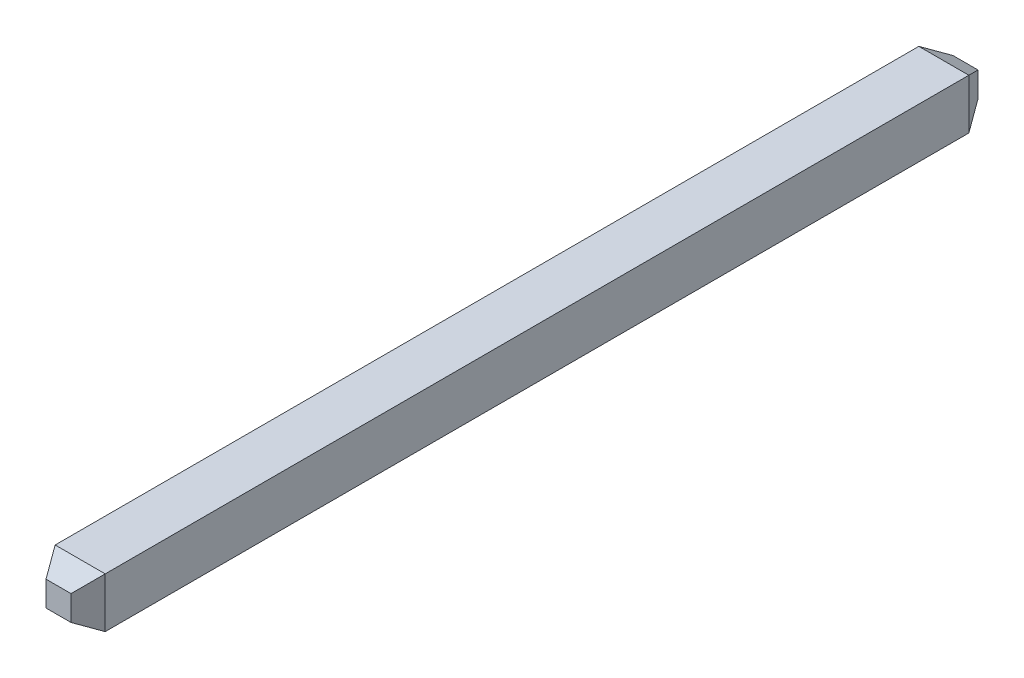
ISO-10303-21;
HEADER;
FILE_DESCRIPTION(('STEP AP214'),'2;1');
FILE_NAME('part.step','',(''),(''),'','','');
FILE_SCHEMA(('AUTOMOTIVE_DESIGN { 1 0 10303 214 1 1 1 1 }'));
ENDSEC;
DATA;
#1=APPLICATION_CONTEXT('core data for automotive mechanical design processes');
#2=APPLICATION_PROTOCOL_DEFINITION('international standard','automotive_design',2000,#1);
#3=PRODUCT_CONTEXT('',#1,'mechanical');
#4=PRODUCT('Part','Part','',(#3));
#5=PRODUCT_RELATED_PRODUCT_CATEGORY('part','',(#4));
#6=PRODUCT_DEFINITION_FORMATION('','',#4);
#7=PRODUCT_DEFINITION_CONTEXT('part definition',#1,'design');
#8=PRODUCT_DEFINITION('design','',#6,#7);
#9=PRODUCT_DEFINITION_SHAPE('','',#8);
#10=(LENGTH_UNIT() NAMED_UNIT(*) SI_UNIT(.MILLI.,.METRE.));
#11=(NAMED_UNIT(*) PLANE_ANGLE_UNIT() SI_UNIT($,.RADIAN.));
#12=(NAMED_UNIT(*) SI_UNIT($,.STERADIAN.) SOLID_ANGLE_UNIT());
#13=UNCERTAINTY_MEASURE_WITH_UNIT(LENGTH_MEASURE(1.E-05),#10,'distance_accuracy_value','');
#14=(GEOMETRIC_REPRESENTATION_CONTEXT(3) GLOBAL_UNCERTAINTY_ASSIGNED_CONTEXT((#13)) GLOBAL_UNIT_ASSIGNED_CONTEXT((#10,
#11,#12)) REPRESENTATION_CONTEXT('',''));
#15=CARTESIAN_POINT('',(0.,0.,0.));
#16=DIRECTION('',(0.,0.,1.));
#17=DIRECTION('',(1.,0.,0.));
#18=AXIS2_PLACEMENT_3D('',#15,#16,#17);
#19=CARTESIAN_POINT('',(-0.321,-0.320500000000001,8.3220058453852));
#20=DIRECTION('',(0.,-0.866025403784438,0.5));
#21=DIRECTION('',(1.,0.,0.));
#22=AXIS2_PLACEMENT_3D('',#19,#20,#21);
#23=PLANE('',#22);
#24=DIRECTION('',(1.,0.,0.));
#25=VECTOR('',#24,1.);
#26=CARTESIAN_POINT('',(0.,-0.16,8.6));
#27=LINE('',#26,#25);
#28=CARTESIAN_POINT('',(-0.159999999999999,-0.16,8.6));
#29=VERTEX_POINT('',#28);
#30=CARTESIAN_POINT('',(0.159999999999998,-0.160000000000001,8.6));
#31=VERTEX_POINT('',#30);
#32=EDGE_CURVE('E77',#29,#31,#27,.T.);
#33=ORIENTED_EDGE('',*,*,#32,.F.);
#34=DIRECTION('',(0.447213595499975,0.447213595499959,0.774596669241473));
#35=VECTOR('',#34,1.);
#36=CARTESIAN_POINT('',(-0.320000000000003,-0.32,8.32287187078898));
#37=LINE('',#36,#35);
#38=CARTESIAN_POINT('',(-0.320000000000002,-0.32,8.32287187078898));
#39=VERTEX_POINT('',#38);
#40=EDGE_CURVE('E119',#39,#29,#37,.T.);
#41=ORIENTED_EDGE('',*,*,#40,.F.);
#42=DIRECTION('',(-1.,0.,0.));
#43=VECTOR('',#42,1.);
#44=CARTESIAN_POINT('',(0.,-0.32,8.32287187078898));
#45=LINE('',#44,#43);
#46=CARTESIAN_POINT('',(0.320000000000002,-0.32,8.32287187078898));
#47=VERTEX_POINT('',#46);
#48=EDGE_CURVE('E91',#47,#39,#45,.T.);
#49=ORIENTED_EDGE('',*,*,#48,.F.);
#50=DIRECTION('',(0.447213595499975,-0.447213595499958,-0.774596669241473));
#51=VECTOR('',#50,1.);
#52=CARTESIAN_POINT('',(0.159999999999998,-0.160000000000001,8.6));
#53=LINE('',#52,#51);
#54=EDGE_CURVE('E19',#31,#47,#53,.T.);
#55=ORIENTED_EDGE('',*,*,#54,.F.);
#56=EDGE_LOOP('',(#33,#41,#49,#55));
#57=FACE_BOUND('',#56,.T.);
#58=ADVANCED_FACE('F15',(#57),#23,.T.);
#59=CARTESIAN_POINT('',(0.321,-0.3205,-2.7220058453852));
#60=DIRECTION('',(0.,-0.866025403784439,-0.499999999999999));
#61=DIRECTION('',(-1.,0.,0.));
#62=AXIS2_PLACEMENT_3D('',#59,#60,#61);
#63=PLANE('',#62);
#64=DIRECTION('',(-1.,0.,0.));
#65=VECTOR('',#64,1.);
#66=CARTESIAN_POINT('',(0.,-0.16,-3.));
#67=LINE('',#66,#65);
#68=CARTESIAN_POINT('',(0.160000000000001,-0.16,-3.));
#69=VERTEX_POINT('',#68);
#70=CARTESIAN_POINT('',(-0.160000000000002,-0.16,-3.));
#71=VERTEX_POINT('',#70);
#72=EDGE_CURVE('E117',#69,#71,#67,.T.);
#73=ORIENTED_EDGE('',*,*,#72,.F.);
#74=DIRECTION('',(-0.447213595499957,0.447213595499959,-0.774596669241484));
#75=VECTOR('',#74,1.);
#76=CARTESIAN_POINT('',(0.320000000000002,-0.32,-2.72287187078898));
#77=LINE('',#76,#75);
#78=CARTESIAN_POINT('',(0.320000000000001,-0.32,-2.72287187078898));
#79=VERTEX_POINT('',#78);
#80=EDGE_CURVE('E94',#79,#69,#77,.T.);
#81=ORIENTED_EDGE('',*,*,#80,.F.);
#82=DIRECTION('',(1.,0.,0.));
#83=VECTOR('',#82,1.);
#84=CARTESIAN_POINT('',(0.,-0.32,-2.72287187078898));
#85=LINE('',#84,#83);
#86=CARTESIAN_POINT('',(-0.320000000000001,-0.32,-2.72287187078898));
#87=VERTEX_POINT('',#86);
#88=EDGE_CURVE('E102',#87,#79,#85,.T.);
#89=ORIENTED_EDGE('',*,*,#88,.F.);
#90=DIRECTION('',(-0.447213595499957,-0.447213595499958,0.774596669241484));
#91=VECTOR('',#90,1.);
#92=CARTESIAN_POINT('',(-0.160000000000002,-0.16,-3.));
#93=LINE('',#92,#91);
#94=EDGE_CURVE('E103',#71,#87,#93,.T.);
#95=ORIENTED_EDGE('',*,*,#94,.F.);
#96=EDGE_LOOP('',(#73,#81,#89,#95));
#97=FACE_BOUND('',#96,.T.);
#98=ADVANCED_FACE('F162',(#97),#63,.T.);
#99=CARTESIAN_POINT('',(-0.161,-0.161000000000001,8.6));
#100=DIRECTION('',(0.,0.,1.));
#101=DIRECTION('',(1.,0.,0.));
#102=AXIS2_PLACEMENT_3D('',#99,#100,#101);
#103=PLANE('',#102);
#104=ORIENTED_EDGE('',*,*,#32,.T.);
#105=DIRECTION('',(0.,-1.,0.));
#106=VECTOR('',#105,1.);
#107=CARTESIAN_POINT('',(0.160000000000001,0.,8.6));
#108=LINE('',#107,#106);
#109=CARTESIAN_POINT('',(0.16,0.160000000000005,8.6));
#110=VERTEX_POINT('',#109);
#111=EDGE_CURVE('E82',#110,#31,#108,.T.);
#112=ORIENTED_EDGE('',*,*,#111,.F.);
#113=DIRECTION('',(1.,0.,0.));
#114=VECTOR('',#113,1.);
#115=CARTESIAN_POINT('',(0.,0.160000000000004,8.6));
#116=LINE('',#115,#114);
#117=CARTESIAN_POINT('',(-0.16,0.160000000000006,8.6));
#118=VERTEX_POINT('',#117);
#119=EDGE_CURVE('E136',#118,#110,#116,.T.);
#120=ORIENTED_EDGE('',*,*,#119,.F.);
#121=DIRECTION('',(0.,1.,0.));
#122=VECTOR('',#121,1.);
#123=CARTESIAN_POINT('',(-0.160000000000001,0.,8.6));
#124=LINE('',#123,#122);
#125=EDGE_CURVE('E84',#29,#118,#124,.T.);
#126=ORIENTED_EDGE('',*,*,#125,.F.);
#127=EDGE_LOOP('',(#104,#112,#120,#126));
#128=FACE_BOUND('',#127,.T.);
#129=ADVANCED_FACE('F79',(#128),#103,.T.);
#130=CARTESIAN_POINT('',(0.3205,-0.321,8.3220058453852));
#131=DIRECTION('',(0.866025403784428,0.,0.500000000000019));
#132=DIRECTION('',(0.,1.,0.));
#133=AXIS2_PLACEMENT_3D('',#130,#131,#132);
#134=PLANE('',#133);
#135=ORIENTED_EDGE('',*,*,#111,.T.);
#136=ORIENTED_EDGE('',*,*,#54,.T.);
#137=DIRECTION('',(0.,-1.,0.));
#138=VECTOR('',#137,1.);
#139=CARTESIAN_POINT('',(0.32,0.,8.32287187078898));
#140=LINE('',#139,#138);
#141=CARTESIAN_POINT('',(0.32,0.320000000000003,8.32287187078898));
#142=VERTEX_POINT('',#141);
#143=EDGE_CURVE('E108',#142,#47,#140,.T.);
#144=ORIENTED_EDGE('',*,*,#143,.F.);
#145=DIRECTION('',(0.44721359549996,0.447213595499957,-0.774596669241482));
#146=VECTOR('',#145,1.);
#147=CARTESIAN_POINT('',(0.16,0.160000000000005,8.6));
#148=LINE('',#147,#146);
#149=EDGE_CURVE('E97',#110,#142,#148,.T.);
#150=ORIENTED_EDGE('',*,*,#149,.F.);
#151=EDGE_LOOP('',(#135,#136,#144,#150));
#152=FACE_BOUND('',#151,.T.);
#153=ADVANCED_FACE('F95',(#152),#134,.T.);
#154=CARTESIAN_POINT('',(0.3205,0.321,-2.7220058453852));
#155=DIRECTION('',(0.866025403784439,0.,-0.499999999999999));
#156=DIRECTION('',(0.,-1.,0.));
#157=AXIS2_PLACEMENT_3D('',#154,#155,#156);
#158=PLANE('',#157);
#159=DIRECTION('',(0.,-1.,0.));
#160=VECTOR('',#159,1.);
#161=CARTESIAN_POINT('',(0.16,0.,-3.));
#162=LINE('',#161,#160);
#163=CARTESIAN_POINT('',(0.16,0.160000000000003,-3.));
#164=VERTEX_POINT('',#163);
#165=EDGE_CURVE('E120',#164,#69,#162,.T.);
#166=ORIENTED_EDGE('',*,*,#165,.F.);
#167=DIRECTION('',(-0.447213595499959,-0.447213595499957,-0.774596669241484));
#168=VECTOR('',#167,1.);
#169=CARTESIAN_POINT('',(0.32,0.320000000000002,-2.72287187078898));
#170=LINE('',#169,#168);
#171=CARTESIAN_POINT('',(0.32,0.320000000000001,-2.72287187078898));
#172=VERTEX_POINT('',#171);
#173=EDGE_CURVE('E116',#172,#164,#170,.T.);
#174=ORIENTED_EDGE('',*,*,#173,.F.);
#175=DIRECTION('',(0.,1.,0.));
#176=VECTOR('',#175,1.);
#177=CARTESIAN_POINT('',(0.32,0.,-2.72287187078898));
#178=LINE('',#177,#176);
#179=EDGE_CURVE('E107',#79,#172,#178,.T.);
#180=ORIENTED_EDGE('',*,*,#179,.F.);
#181=ORIENTED_EDGE('',*,*,#80,.T.);
#182=EDGE_LOOP('',(#166,#174,#180,#181));
#183=FACE_BOUND('',#182,.T.);
#184=ADVANCED_FACE('F158',(#183),#158,.T.);
#185=CARTESIAN_POINT('',(0.161,-0.161,-3.));
#186=DIRECTION('',(0.,0.,-1.));
#187=DIRECTION('',(-1.,0.,0.));
#188=AXIS2_PLACEMENT_3D('',#185,#186,#187);
#189=PLANE('',#188);
#190=ORIENTED_EDGE('',*,*,#72,.T.);
#191=DIRECTION('',(0.,-1.,0.));
#192=VECTOR('',#191,1.);
#193=CARTESIAN_POINT('',(-0.160000000000002,0.,-3.));
#194=LINE('',#193,#192);
#195=CARTESIAN_POINT('',(-0.160000000000001,0.160000000000002,-3.));
#196=VERTEX_POINT('',#195);
#197=EDGE_CURVE('E132',#196,#71,#194,.T.);
#198=ORIENTED_EDGE('',*,*,#197,.F.);
#199=DIRECTION('',(-1.,0.,0.));
#200=VECTOR('',#199,1.);
#201=CARTESIAN_POINT('',(0.,0.160000000000002,-3.));
#202=LINE('',#201,#200);
#203=EDGE_CURVE('E143',#164,#196,#202,.T.);
#204=ORIENTED_EDGE('',*,*,#203,.F.);
#205=ORIENTED_EDGE('',*,*,#165,.T.);
#206=EDGE_LOOP('',(#190,#198,#204,#205));
#207=FACE_BOUND('',#206,.T.);
#208=ADVANCED_FACE('F165',(#207),#189,.T.);
#209=CARTESIAN_POINT('',(-0.3205,0.321,8.3220058453852));
#210=DIRECTION('',(-0.866025403784428,0.,0.500000000000019));
#211=DIRECTION('',(0.,-1.,0.));
#212=AXIS2_PLACEMENT_3D('',#209,#210,#211);
#213=PLANE('',#212);
#214=ORIENTED_EDGE('',*,*,#125,.T.);
#215=DIRECTION('',(0.44721359549996,-0.447213595499957,0.774596669241482));
#216=VECTOR('',#215,1.);
#217=CARTESIAN_POINT('',(-0.32,0.320000000000004,8.32287187078898));
#218=LINE('',#217,#216);
#219=CARTESIAN_POINT('',(-0.32,0.320000000000003,8.32287187078899));
#220=VERTEX_POINT('',#219);
#221=EDGE_CURVE('E113',#220,#118,#218,.T.);
#222=ORIENTED_EDGE('',*,*,#221,.F.);
#223=DIRECTION('',(0.,1.,0.));
#224=VECTOR('',#223,1.);
#225=CARTESIAN_POINT('',(-0.32,0.,8.32287187078898));
#226=LINE('',#225,#224);
#227=EDGE_CURVE('E123',#39,#220,#226,.T.);
#228=ORIENTED_EDGE('',*,*,#227,.F.);
#229=ORIENTED_EDGE('',*,*,#40,.T.);
#230=EDGE_LOOP('',(#214,#222,#228,#229));
#231=FACE_BOUND('',#230,.T.);
#232=ADVANCED_FACE('F185',(#231),#213,.T.);
#233=CARTESIAN_POINT('',(-0.3205,-0.321,-2.7220058453852));
#234=DIRECTION('',(-0.866025403784439,0.,-0.499999999999999));
#235=DIRECTION('',(0.,1.,0.));
#236=AXIS2_PLACEMENT_3D('',#233,#234,#235);
#237=PLANE('',#236);
#238=ORIENTED_EDGE('',*,*,#197,.T.);
#239=ORIENTED_EDGE('',*,*,#94,.T.);
#240=DIRECTION('',(0.,-1.,0.));
#241=VECTOR('',#240,1.);
#242=CARTESIAN_POINT('',(-0.32,0.,-2.72287187078898));
#243=LINE('',#242,#241);
#244=CARTESIAN_POINT('',(-0.32,0.320000000000001,-2.72287187078898));
#245=VERTEX_POINT('',#244);
#246=EDGE_CURVE('E34',#245,#87,#243,.T.);
#247=ORIENTED_EDGE('',*,*,#246,.F.);
#248=DIRECTION('',(-0.447213595499958,0.447213595499957,0.774596669241484));
#249=VECTOR('',#248,1.);
#250=CARTESIAN_POINT('',(-0.16,0.160000000000002,-3.));
#251=LINE('',#250,#249);
#252=EDGE_CURVE('E126',#196,#245,#251,.T.);
#253=ORIENTED_EDGE('',*,*,#252,.F.);
#254=EDGE_LOOP('',(#238,#239,#247,#253));
#255=FACE_BOUND('',#254,.T.);
#256=ADVANCED_FACE('F175',(#255),#237,.T.);
#257=CARTESIAN_POINT('',(-0.321,-0.32,-2.72387187078898));
#258=DIRECTION('',(0.,-1.,0.));
#259=DIRECTION('',(1.,0.,0.));
#260=AXIS2_PLACEMENT_3D('',#257,#258,#259);
#261=PLANE('',#260);
#262=ORIENTED_EDGE('',*,*,#88,.T.);
#263=DIRECTION('',(0.,0.,-1.));
#264=VECTOR('',#263,1.);
#265=CARTESIAN_POINT('',(0.32,-0.32,2.8));
#266=LINE('',#265,#264);
#267=EDGE_CURVE('E104',#47,#79,#266,.T.);
#268=ORIENTED_EDGE('',*,*,#267,.F.);
#269=ORIENTED_EDGE('',*,*,#48,.T.);
#270=DIRECTION('',(0.,0.,1.));
#271=VECTOR('',#270,1.);
#272=CARTESIAN_POINT('',(-0.32,-0.32,2.8));
#273=LINE('',#272,#271);
#274=EDGE_CURVE('E127',#87,#39,#273,.T.);
#275=ORIENTED_EDGE('',*,*,#274,.F.);
#276=EDGE_LOOP('',(#262,#268,#269,#275));
#277=FACE_BOUND('',#276,.T.);
#278=ADVANCED_FACE('F173',(#277),#261,.T.);
#279=CARTESIAN_POINT('',(0.321,0.320500000000001,8.3220058453852));
#280=DIRECTION('',(0.,0.866025403784438,0.5));
#281=DIRECTION('',(-1.,0.,0.));
#282=AXIS2_PLACEMENT_3D('',#279,#280,#281);
#283=PLANE('',#282);
#284=ORIENTED_EDGE('',*,*,#119,.T.);
#285=ORIENTED_EDGE('',*,*,#149,.T.);
#286=DIRECTION('',(1.,0.,0.));
#287=VECTOR('',#286,1.);
#288=CARTESIAN_POINT('',(0.,0.32,8.32287187078898));
#289=LINE('',#288,#287);
#290=EDGE_CURVE('E130',#220,#142,#289,.T.);
#291=ORIENTED_EDGE('',*,*,#290,.F.);
#292=ORIENTED_EDGE('',*,*,#221,.T.);
#293=EDGE_LOOP('',(#284,#285,#291,#292));
#294=FACE_BOUND('',#293,.T.);
#295=ADVANCED_FACE('F183',(#294),#283,.T.);
#296=CARTESIAN_POINT('',(0.32,-0.321,-2.72387187078898));
#297=DIRECTION('',(1.,0.,0.));
#298=DIRECTION('',(0.,1.,0.));
#299=AXIS2_PLACEMENT_3D('',#296,#297,#298);
#300=PLANE('',#299);
#301=ORIENTED_EDGE('',*,*,#179,.T.);
#302=DIRECTION('',(0.,0.,-1.));
#303=VECTOR('',#302,1.);
#304=CARTESIAN_POINT('',(0.32,0.32,2.8));
#305=LINE('',#304,#303);
#306=EDGE_CURVE('E138',#142,#172,#305,.T.);
#307=ORIENTED_EDGE('',*,*,#306,.F.);
#308=ORIENTED_EDGE('',*,*,#143,.T.);
#309=ORIENTED_EDGE('',*,*,#267,.T.);
#310=EDGE_LOOP('',(#301,#307,#308,#309));
#311=FACE_BOUND('',#310,.T.);
#312=ADVANCED_FACE('F171',(#311),#300,.T.);
#313=CARTESIAN_POINT('',(-0.321,0.3205,-2.7220058453852));
#314=DIRECTION('',(0.,0.866025403784439,-0.499999999999999));
#315=DIRECTION('',(1.,0.,0.));
#316=AXIS2_PLACEMENT_3D('',#313,#314,#315);
#317=PLANE('',#316);
#318=ORIENTED_EDGE('',*,*,#203,.T.);
#319=ORIENTED_EDGE('',*,*,#252,.T.);
#320=DIRECTION('',(-1.,0.,0.));
#321=VECTOR('',#320,1.);
#322=CARTESIAN_POINT('',(0.,0.32,-2.72287187078898));
#323=LINE('',#322,#321);
#324=EDGE_CURVE('E25',#172,#245,#323,.T.);
#325=ORIENTED_EDGE('',*,*,#324,.F.);
#326=ORIENTED_EDGE('',*,*,#173,.T.);
#327=EDGE_LOOP('',(#318,#319,#325,#326));
#328=FACE_BOUND('',#327,.T.);
#329=ADVANCED_FACE('F168',(#328),#317,.T.);
#330=CARTESIAN_POINT('',(-0.32,0.321,-2.72387187078898));
#331=DIRECTION('',(-1.,0.,0.));
#332=DIRECTION('',(0.,-1.,0.));
#333=AXIS2_PLACEMENT_3D('',#330,#331,#332);
#334=PLANE('',#333);
#335=ORIENTED_EDGE('',*,*,#246,.T.);
#336=ORIENTED_EDGE('',*,*,#274,.T.);
#337=ORIENTED_EDGE('',*,*,#227,.T.);
#338=DIRECTION('',(0.,0.,1.));
#339=VECTOR('',#338,1.);
#340=CARTESIAN_POINT('',(-0.32,0.32,2.8));
#341=LINE('',#340,#339);
#342=EDGE_CURVE('E10',#245,#220,#341,.T.);
#343=ORIENTED_EDGE('',*,*,#342,.F.);
#344=EDGE_LOOP('',(#335,#336,#337,#343));
#345=FACE_BOUND('',#344,.T.);
#346=ADVANCED_FACE('F178',(#345),#334,.T.);
#347=CARTESIAN_POINT('',(0.321,0.32,-2.72387187078898));
#348=DIRECTION('',(0.,1.,0.));
#349=DIRECTION('',(-1.,0.,0.));
#350=AXIS2_PLACEMENT_3D('',#347,#348,#349);
#351=PLANE('',#350);
#352=ORIENTED_EDGE('',*,*,#324,.T.);
#353=ORIENTED_EDGE('',*,*,#342,.T.);
#354=ORIENTED_EDGE('',*,*,#290,.T.);
#355=ORIENTED_EDGE('',*,*,#306,.T.);
#356=EDGE_LOOP('',(#352,#353,#354,#355));
#357=FACE_BOUND('',#356,.T.);
#358=ADVANCED_FACE('F17',(#357),#351,.T.);
#359=CLOSED_SHELL('',(#58,#98,#129,#153,#184,#208,#232,#256,#278,#295,#312,#329,#346,#358));
#360=MANIFOLD_SOLID_BREP('B1',#359);
#361=ADVANCED_BREP_SHAPE_REPRESENTATION('',(#18,#360),#14);
#362=SHAPE_DEFINITION_REPRESENTATION(#9,#361);
ENDSEC;
END-ISO-10303-21;
